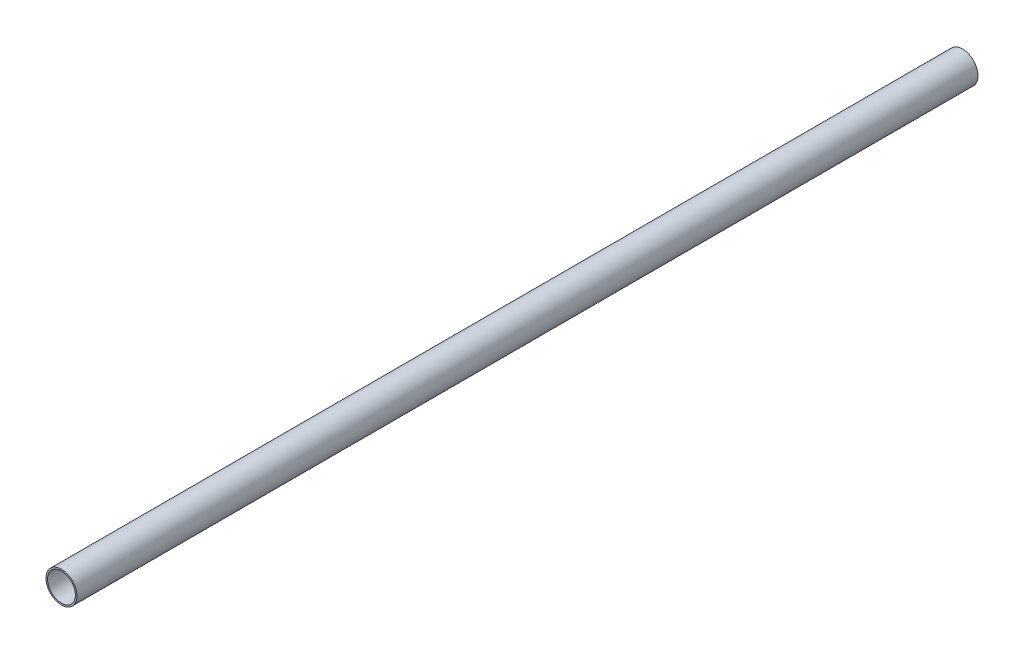
ISO-10303-21;
HEADER;
FILE_DESCRIPTION(('STEP AP214'),'2;1');
FILE_NAME('part.step','',(''),(''),'','','');
FILE_SCHEMA(('AUTOMOTIVE_DESIGN { 1 0 10303 214 1 1 1 1 }'));
ENDSEC;
DATA;
#1=APPLICATION_CONTEXT('core data for automotive mechanical design processes');
#2=APPLICATION_PROTOCOL_DEFINITION('international standard','automotive_design',2000,#1);
#3=PRODUCT_CONTEXT('',#1,'mechanical');
#4=PRODUCT('Part','Part','',(#3));
#5=PRODUCT_RELATED_PRODUCT_CATEGORY('part','',(#4));
#6=PRODUCT_DEFINITION_FORMATION('','',#4);
#7=PRODUCT_DEFINITION_CONTEXT('part definition',#1,'design');
#8=PRODUCT_DEFINITION('design','',#6,#7);
#9=PRODUCT_DEFINITION_SHAPE('','',#8);
#10=(LENGTH_UNIT() NAMED_UNIT(*) SI_UNIT(.MILLI.,.METRE.));
#11=(NAMED_UNIT(*) PLANE_ANGLE_UNIT() SI_UNIT($,.RADIAN.));
#12=(NAMED_UNIT(*) SI_UNIT($,.STERADIAN.) SOLID_ANGLE_UNIT());
#13=UNCERTAINTY_MEASURE_WITH_UNIT(LENGTH_MEASURE(1.E-05),#10,'distance_accuracy_value','');
#14=(GEOMETRIC_REPRESENTATION_CONTEXT(3) GLOBAL_UNCERTAINTY_ASSIGNED_CONTEXT((#13)) GLOBAL_UNIT_ASSIGNED_CONTEXT((#10,
#11,#12)) REPRESENTATION_CONTEXT('',''));
#15=CARTESIAN_POINT('',(0.,0.,0.));
#16=DIRECTION('',(0.,0.,1.));
#17=DIRECTION('',(1.,0.,0.));
#18=AXIS2_PLACEMENT_3D('',#15,#16,#17);
#19=CARTESIAN_POINT('',(0.,0.,145.5));
#20=DIRECTION('',(0.,0.,-1.));
#21=DIRECTION('',(-1.,0.,0.));
#22=AXIS2_PLACEMENT_3D('',#19,#20,#21);
#23=CYLINDRICAL_SURFACE('',#22,5.);
#24=CARTESIAN_POINT('',(0.,0.,145.5));
#25=DIRECTION('',(0.,0.,1.));
#26=DIRECTION('',(1.,0.,0.));
#27=AXIS2_PLACEMENT_3D('',#24,#25,#26);
#28=CIRCLE('',#27,5.);
#29=CARTESIAN_POINT('',(5.,0.,145.5));
#30=VERTEX_POINT('',#29);
#31=EDGE_CURVE('E10',#30,#30,#28,.T.);
#32=ORIENTED_EDGE('',*,*,#31,.F.);
#33=EDGE_LOOP('',(#32));
#34=FACE_BOUND('',#33,.T.);
#35=CARTESIAN_POINT('',(0.,0.,-145.5));
#36=DIRECTION('',(0.,0.,1.));
#37=DIRECTION('',(1.,0.,0.));
#38=AXIS2_PLACEMENT_3D('',#35,#36,#37);
#39=CIRCLE('',#38,5.);
#40=CARTESIAN_POINT('',(5.,0.,-145.5));
#41=VERTEX_POINT('',#40);
#42=EDGE_CURVE('E33',#41,#41,#39,.T.);
#43=ORIENTED_EDGE('',*,*,#42,.T.);
#44=EDGE_LOOP('',(#43));
#45=FACE_BOUND('',#44,.T.);
#46=ADVANCED_FACE('F30',(#34,#45),#23,.T.);
#47=CARTESIAN_POINT('',(0.,0.,145.5));
#48=DIRECTION('',(0.,0.,1.));
#49=DIRECTION('',(1.,0.,0.));
#50=AXIS2_PLACEMENT_3D('',#47,#48,#49);
#51=PLANE('',#50);
#52=CARTESIAN_POINT('',(0.,0.,145.5));
#53=DIRECTION('',(0.,0.,1.));
#54=DIRECTION('',(1.,0.,0.));
#55=AXIS2_PLACEMENT_3D('',#52,#53,#54);
#56=CIRCLE('',#55,4.5);
#57=CARTESIAN_POINT('',(4.5,0.,145.5));
#58=VERTEX_POINT('',#57);
#59=EDGE_CURVE('E40',#58,#58,#56,.T.);
#60=ORIENTED_EDGE('',*,*,#59,.F.);
#61=EDGE_LOOP('',(#60));
#62=FACE_BOUND('',#61,.T.);
#63=ORIENTED_EDGE('',*,*,#31,.T.);
#64=EDGE_LOOP('',(#63));
#65=FACE_BOUND('',#64,.T.);
#66=ADVANCED_FACE('F51',(#62,#65),#51,.T.);
#67=CARTESIAN_POINT('',(0.,0.,-145.5));
#68=DIRECTION('',(0.,0.,1.));
#69=DIRECTION('',(1.,0.,0.));
#70=AXIS2_PLACEMENT_3D('',#67,#68,#69);
#71=PLANE('',#70);
#72=CARTESIAN_POINT('',(0.,0.,-145.5));
#73=DIRECTION('',(0.,0.,1.));
#74=DIRECTION('',(1.,0.,0.));
#75=AXIS2_PLACEMENT_3D('',#72,#73,#74);
#76=CIRCLE('',#75,4.5);
#77=CARTESIAN_POINT('',(4.5,0.,-145.5));
#78=VERTEX_POINT('',#77);
#79=EDGE_CURVE('E42',#78,#78,#76,.T.);
#80=ORIENTED_EDGE('',*,*,#79,.T.);
#81=EDGE_LOOP('',(#80));
#82=FACE_BOUND('',#81,.T.);
#83=ORIENTED_EDGE('',*,*,#42,.F.);
#84=EDGE_LOOP('',(#83));
#85=FACE_BOUND('',#84,.T.);
#86=ADVANCED_FACE('F53',(#82,#85),#71,.F.);
#87=CARTESIAN_POINT('',(0.,0.,145.5));
#88=DIRECTION('',(0.,0.,-1.));
#89=DIRECTION('',(-1.,0.,0.));
#90=AXIS2_PLACEMENT_3D('',#87,#88,#89);
#91=CYLINDRICAL_SURFACE('',#90,4.5);
#92=ORIENTED_EDGE('',*,*,#59,.T.);
#93=EDGE_LOOP('',(#92));
#94=FACE_BOUND('',#93,.T.);
#95=ORIENTED_EDGE('',*,*,#79,.F.);
#96=EDGE_LOOP('',(#95));
#97=FACE_BOUND('',#96,.T.);
#98=ADVANCED_FACE('F48',(#94,#97),#91,.F.);
#99=CLOSED_SHELL('',(#46,#66,#86,#98));
#100=MANIFOLD_SOLID_BREP('B2',#99);
#101=ADVANCED_BREP_SHAPE_REPRESENTATION('',(#18,#100),#14);
#102=SHAPE_DEFINITION_REPRESENTATION(#9,#101);
ENDSEC;
END-ISO-10303-21;
